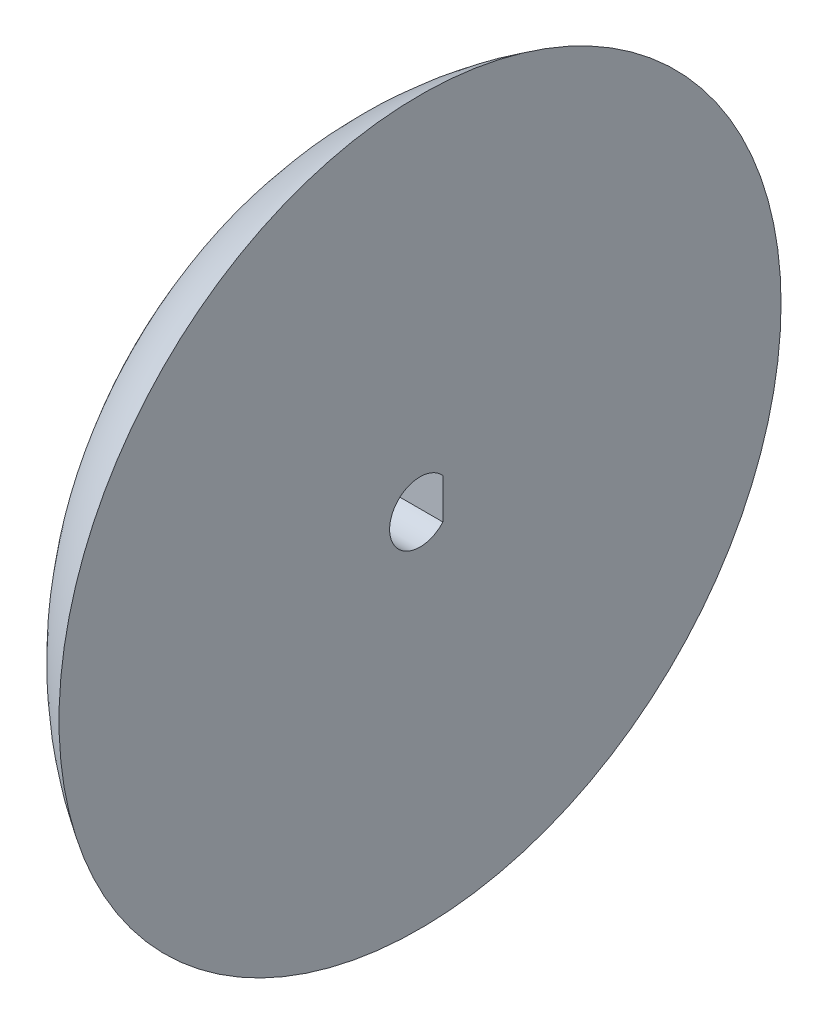
ISO-10303-21;
HEADER;
FILE_DESCRIPTION(('STEP AP214'),'2;1');
FILE_NAME('part.step','',(''),(''),'','','');
FILE_SCHEMA(('AUTOMOTIVE_DESIGN { 1 0 10303 214 1 1 1 1 }'));
ENDSEC;
DATA;
#1=APPLICATION_CONTEXT('core data for automotive mechanical design processes');
#2=APPLICATION_PROTOCOL_DEFINITION('international standard','automotive_design',2000,#1);
#3=PRODUCT_CONTEXT('',#1,'mechanical');
#4=PRODUCT('Part','Part','',(#3));
#5=PRODUCT_RELATED_PRODUCT_CATEGORY('part','',(#4));
#6=PRODUCT_DEFINITION_FORMATION('','',#4);
#7=PRODUCT_DEFINITION_CONTEXT('part definition',#1,'design');
#8=PRODUCT_DEFINITION('design','',#6,#7);
#9=PRODUCT_DEFINITION_SHAPE('','',#8);
#10=(LENGTH_UNIT() NAMED_UNIT(*) SI_UNIT(.MILLI.,.METRE.));
#11=(NAMED_UNIT(*) PLANE_ANGLE_UNIT() SI_UNIT($,.RADIAN.));
#12=(NAMED_UNIT(*) SI_UNIT($,.STERADIAN.) SOLID_ANGLE_UNIT());
#13=UNCERTAINTY_MEASURE_WITH_UNIT(LENGTH_MEASURE(1.E-05),#10,'distance_accuracy_value','');
#14=(GEOMETRIC_REPRESENTATION_CONTEXT(3) GLOBAL_UNCERTAINTY_ASSIGNED_CONTEXT((#13)) GLOBAL_UNIT_ASSIGNED_CONTEXT((#10,
#11,#12)) REPRESENTATION_CONTEXT('',''));
#15=CARTESIAN_POINT('',(0.,0.,0.));
#16=DIRECTION('',(0.,0.,1.));
#17=DIRECTION('',(1.,0.,0.));
#18=AXIS2_PLACEMENT_3D('',#15,#16,#17);
#19=CARTESIAN_POINT('',(-4.35137970864083,2.21545626375615,0.));
#20=DIRECTION('',(-1.,0.,0.));
#21=DIRECTION('',(0.,0.,1.));
#22=AXIS2_PLACEMENT_3D('',#19,#20,#21);
#23=PLANE('',#22);
#24=CARTESIAN_POINT('',(-4.35137970864083,2.21545626375615,0.));
#25=DIRECTION('',(1.,0.,0.));
#26=DIRECTION('',(0.,0.,-1.));
#27=AXIS2_PLACEMENT_3D('',#24,#25,#26);
#28=CIRCLE('',#27,5.29916593105491);
#29=CARTESIAN_POINT('',(-4.35137970864083,2.21545626375615,-5.29916593105491));
#30=VERTEX_POINT('',#29);
#31=EDGE_CURVE('E47',#30,#30,#28,.T.);
#32=ORIENTED_EDGE('',*,*,#31,.F.);
#33=EDGE_LOOP('',(#32));
#34=FACE_BOUND('',#33,.T.);
#35=ADVANCED_FACE('F39',(#34),#23,.T.);
#36=CARTESIAN_POINT('',(3.35075725897415,21.1947343689046,0.));
#37=DIRECTION('',(1.,0.,0.));
#38=DIRECTION('',(0.,0.,-1.));
#39=AXIS2_PLACEMENT_3D('',#36,#37,#38);
#40=PLANE('',#39);
#41=CARTESIAN_POINT('',(3.35075725897415,2.21545626375615,0.));
#42=DIRECTION('',(1.,0.,0.));
#43=DIRECTION('',(0.,0.,-1.));
#44=AXIS2_PLACEMENT_3D('',#41,#42,#43);
#45=CIRCLE('',#44,1.6);
#46=CARTESIAN_POINT('',(3.35075725897415,3.27375678818198,-1.2));
#47=VERTEX_POINT('',#46);
#48=CARTESIAN_POINT('',(3.35075725897415,1.15715573933031,-1.2));
#49=VERTEX_POINT('',#48);
#50=EDGE_CURVE('E54',#47,#49,#45,.T.);
#51=ORIENTED_EDGE('',*,*,#50,.F.);
#52=DIRECTION('',(0.,1.,0.));
#53=VECTOR('',#52,1.);
#54=CARTESIAN_POINT('',(3.35075725897415,3.27375678818198,-1.2));
#55=LINE('',#54,#53);
#56=EDGE_CURVE('E74',#49,#47,#55,.T.);
#57=ORIENTED_EDGE('',*,*,#56,.F.);
#58=EDGE_LOOP('',(#51,#57));
#59=FACE_BOUND('',#58,.T.);
#60=CARTESIAN_POINT('',(3.35075725897415,2.21545626375615,0.));
#61=DIRECTION('',(1.,0.,0.));
#62=DIRECTION('',(0.,0.,-1.));
#63=AXIS2_PLACEMENT_3D('',#60,#61,#62);
#64=CIRCLE('',#63,18.9792781051484);
#65=CARTESIAN_POINT('',(3.35075725897415,2.21545626375615,-18.9792781051484));
#66=VERTEX_POINT('',#65);
#67=EDGE_CURVE('E11',#66,#66,#64,.T.);
#68=ORIENTED_EDGE('',*,*,#67,.T.);
#69=EDGE_LOOP('',(#68));
#70=FACE_BOUND('',#69,.T.);
#71=ADVANCED_FACE('F79',(#59,#70),#40,.T.);
#72=CARTESIAN_POINT('',(11.6486202913592,2.21545626375615,0.));
#73=DIRECTION('',(1.,0.,0.));
#74=DIRECTION('',(0.,0.,-1.));
#75=AXIS2_PLACEMENT_3D('',#72,#73,#74);
#76=DEGENERATE_TOROIDAL_SURFACE('',#75,5.29916593105502,16.,.T.);
#77=ORIENTED_EDGE('',*,*,#31,.T.);
#78=EDGE_LOOP('',(#77));
#79=FACE_BOUND('',#78,.T.);
#80=ORIENTED_EDGE('',*,*,#67,.F.);
#81=EDGE_LOOP('',(#80));
#82=FACE_BOUND('',#81,.T.);
#83=ADVANCED_FACE('F92',(#79,#82),#76,.T.);
#84=CARTESIAN_POINT('',(-3.64924274102585,2.21545626375615,0.));
#85=DIRECTION('',(1.,0.,0.));
#86=DIRECTION('',(0.,0.,-1.));
#87=AXIS2_PLACEMENT_3D('',#84,#85,#86);
#88=CYLINDRICAL_SURFACE('',#87,1.6);
#89=ORIENTED_EDGE('',*,*,#50,.T.);
#90=DIRECTION('',(1.,0.,0.));
#91=VECTOR('',#90,1.);
#92=CARTESIAN_POINT('',(-3.64924274102585,1.15715573933031,-1.2));
#93=LINE('',#92,#91);
#94=CARTESIAN_POINT('',(-3.64924274102585,1.15715573933031,-1.2));
#95=VERTEX_POINT('',#94);
#96=EDGE_CURVE('E71',#95,#49,#93,.T.);
#97=ORIENTED_EDGE('',*,*,#96,.F.);
#98=CARTESIAN_POINT('',(-3.64924274102585,2.21545626375615,0.));
#99=DIRECTION('',(1.,0.,0.));
#100=DIRECTION('',(0.,0.,-1.));
#101=AXIS2_PLACEMENT_3D('',#98,#99,#100);
#102=CIRCLE('',#101,1.6);
#103=CARTESIAN_POINT('',(-3.64924274102585,3.27375678818198,-1.2));
#104=VERTEX_POINT('',#103);
#105=EDGE_CURVE('E68',#104,#95,#102,.T.);
#106=ORIENTED_EDGE('',*,*,#105,.F.);
#107=DIRECTION('',(1.,0.,0.));
#108=VECTOR('',#107,1.);
#109=CARTESIAN_POINT('',(-3.64924274102585,3.27375678818198,-1.2));
#110=LINE('',#109,#108);
#111=EDGE_CURVE('E62',#104,#47,#110,.T.);
#112=ORIENTED_EDGE('',*,*,#111,.T.);
#113=EDGE_LOOP('',(#89,#97,#106,#112));
#114=FACE_BOUND('',#113,.T.);
#115=ADVANCED_FACE('F66',(#114),#88,.F.);
#116=CARTESIAN_POINT('',(-3.64924274102585,3.27375678818198,-1.2));
#117=DIRECTION('',(0.,0.,-1.));
#118=DIRECTION('',(-1.,0.,0.));
#119=AXIS2_PLACEMENT_3D('',#116,#117,#118);
#120=PLANE('',#119);
#121=ORIENTED_EDGE('',*,*,#56,.T.);
#122=ORIENTED_EDGE('',*,*,#111,.F.);
#123=DIRECTION('',(0.,1.,0.));
#124=VECTOR('',#123,1.);
#125=CARTESIAN_POINT('',(-3.64924274102585,3.27375678818198,-1.2));
#126=LINE('',#125,#124);
#127=EDGE_CURVE('E84',#95,#104,#126,.T.);
#128=ORIENTED_EDGE('',*,*,#127,.F.);
#129=ORIENTED_EDGE('',*,*,#96,.T.);
#130=EDGE_LOOP('',(#121,#122,#128,#129));
#131=FACE_BOUND('',#130,.T.);
#132=ADVANCED_FACE('F75',(#131),#120,.F.);
#133=CARTESIAN_POINT('',(-3.64924274102585,2.21545626375615,0.));
#134=DIRECTION('',(1.,0.,0.));
#135=DIRECTION('',(0.,0.,-1.));
#136=AXIS2_PLACEMENT_3D('',#133,#134,#135);
#137=PLANE('',#136);
#138=ORIENTED_EDGE('',*,*,#105,.T.);
#139=ORIENTED_EDGE('',*,*,#127,.T.);
#140=EDGE_LOOP('',(#138,#139));
#141=FACE_BOUND('',#140,.T.);
#142=ADVANCED_FACE('F108',(#141),#137,.T.);
#143=CLOSED_SHELL('',(#35,#71,#83,#115,#132,#142));
#144=MANIFOLD_SOLID_BREP('B2',#143);
#145=ADVANCED_BREP_SHAPE_REPRESENTATION('',(#18,#144),#14);
#146=SHAPE_DEFINITION_REPRESENTATION(#9,#145);
ENDSEC;
END-ISO-10303-21;
